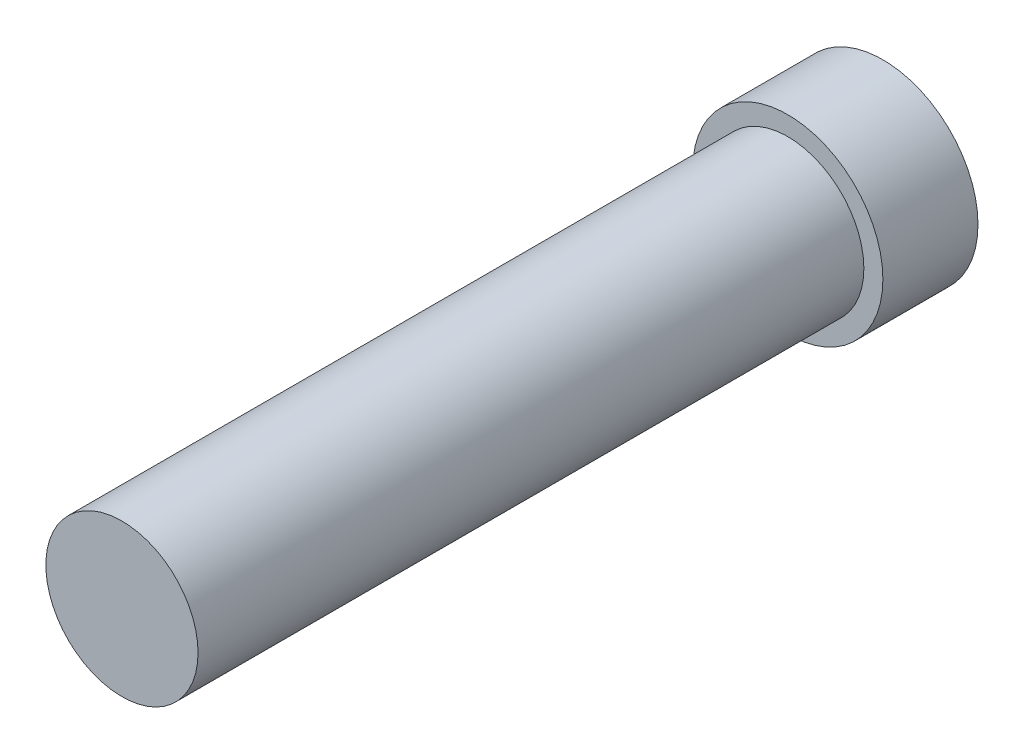
ISO-10303-21;
HEADER;
FILE_DESCRIPTION(('STEP AP214'),'2;1');
FILE_NAME('part.step','',(''),(''),'','','');
FILE_SCHEMA(('AUTOMOTIVE_DESIGN { 1 0 10303 214 1 1 1 1 }'));
ENDSEC;
DATA;
#1=APPLICATION_CONTEXT('core data for automotive mechanical design processes');
#2=APPLICATION_PROTOCOL_DEFINITION('international standard','automotive_design',2000,#1);
#3=PRODUCT_CONTEXT('',#1,'mechanical');
#4=PRODUCT('Part','Part','',(#3));
#5=PRODUCT_RELATED_PRODUCT_CATEGORY('part','',(#4));
#6=PRODUCT_DEFINITION_FORMATION('','',#4);
#7=PRODUCT_DEFINITION_CONTEXT('part definition',#1,'design');
#8=PRODUCT_DEFINITION('design','',#6,#7);
#9=PRODUCT_DEFINITION_SHAPE('','',#8);
#10=(LENGTH_UNIT() NAMED_UNIT(*) SI_UNIT(.MILLI.,.METRE.));
#11=(NAMED_UNIT(*) PLANE_ANGLE_UNIT() SI_UNIT($,.RADIAN.));
#12=(NAMED_UNIT(*) SI_UNIT($,.STERADIAN.) SOLID_ANGLE_UNIT());
#13=UNCERTAINTY_MEASURE_WITH_UNIT(LENGTH_MEASURE(1.E-05),#10,'distance_accuracy_value','');
#14=(GEOMETRIC_REPRESENTATION_CONTEXT(3) GLOBAL_UNCERTAINTY_ASSIGNED_CONTEXT((#13)) GLOBAL_UNIT_ASSIGNED_CONTEXT((#10,
#11,#12)) REPRESENTATION_CONTEXT('',''));
#15=CARTESIAN_POINT('',(0.,0.,0.));
#16=DIRECTION('',(0.,0.,1.));
#17=DIRECTION('',(1.,0.,0.));
#18=AXIS2_PLACEMENT_3D('',#15,#16,#17);
#19=CARTESIAN_POINT('',(0.,0.,40.));
#20=DIRECTION('',(0.,0.,-1.));
#21=DIRECTION('',(-1.,0.,0.));
#22=AXIS2_PLACEMENT_3D('',#19,#20,#21);
#23=CYLINDRICAL_SURFACE('',#22,4.);
#24=CARTESIAN_POINT('',(0.,0.,5.));
#25=DIRECTION('',(0.,0.,1.));
#26=DIRECTION('',(1.,0.,0.));
#27=AXIS2_PLACEMENT_3D('',#24,#25,#26);
#28=CIRCLE('',#27,4.);
#29=CARTESIAN_POINT('',(4.,0.,5.));
#30=VERTEX_POINT('',#29);
#31=EDGE_CURVE('E129',#30,#30,#28,.T.);
#32=ORIENTED_EDGE('',*,*,#31,.T.);
#33=EDGE_LOOP('',(#32));
#34=FACE_BOUND('',#33,.T.);
#35=CARTESIAN_POINT('',(0.,0.,40.));
#36=DIRECTION('',(0.,0.,1.));
#37=DIRECTION('',(1.,0.,0.));
#38=AXIS2_PLACEMENT_3D('',#35,#36,#37);
#39=CIRCLE('',#38,4.);
#40=CARTESIAN_POINT('',(4.,0.,40.));
#41=VERTEX_POINT('',#40);
#42=EDGE_CURVE('E11',#41,#41,#39,.T.);
#43=ORIENTED_EDGE('',*,*,#42,.F.);
#44=EDGE_LOOP('',(#43));
#45=FACE_BOUND('',#44,.T.);
#46=ADVANCED_FACE('F34',(#34,#45),#23,.T.);
#47=CARTESIAN_POINT('',(0.,0.,40.));
#48=DIRECTION('',(0.,0.,1.));
#49=DIRECTION('',(1.,0.,0.));
#50=AXIS2_PLACEMENT_3D('',#47,#48,#49);
#51=PLANE('',#50);
#52=ORIENTED_EDGE('',*,*,#42,.T.);
#53=EDGE_LOOP('',(#52));
#54=FACE_BOUND('',#53,.T.);
#55=ADVANCED_FACE('F160',(#54),#51,.T.);
#56=CARTESIAN_POINT('',(0.,0.,5.));
#57=DIRECTION('',(0.,0.,1.));
#58=DIRECTION('',(1.,0.,0.));
#59=AXIS2_PLACEMENT_3D('',#56,#57,#58);
#60=PLANE('',#59);
#61=CARTESIAN_POINT('',(0.,0.,5.));
#62=DIRECTION('',(0.,0.,1.));
#63=DIRECTION('',(1.,0.,0.));
#64=AXIS2_PLACEMENT_3D('',#61,#62,#63);
#65=CIRCLE('',#64,5.);
#66=CARTESIAN_POINT('',(5.,0.,5.));
#67=VERTEX_POINT('',#66);
#68=EDGE_CURVE('E41',#67,#67,#65,.T.);
#69=ORIENTED_EDGE('',*,*,#68,.T.);
#70=EDGE_LOOP('',(#69));
#71=FACE_BOUND('',#70,.T.);
#72=ORIENTED_EDGE('',*,*,#31,.F.);
#73=EDGE_LOOP('',(#72));
#74=FACE_BOUND('',#73,.T.);
#75=ADVANCED_FACE('F155',(#71,#74),#60,.T.);
#76=CARTESIAN_POINT('',(0.,0.,5.));
#77=DIRECTION('',(0.,0.,-1.));
#78=DIRECTION('',(-1.,0.,0.));
#79=AXIS2_PLACEMENT_3D('',#76,#77,#78);
#80=CYLINDRICAL_SURFACE('',#79,5.);
#81=ORIENTED_EDGE('',*,*,#68,.F.);
#82=EDGE_LOOP('',(#81));
#83=FACE_BOUND('',#82,.T.);
#84=CARTESIAN_POINT('',(0.,0.,0.));
#85=DIRECTION('',(0.,0.,1.));
#86=DIRECTION('',(1.,0.,0.));
#87=AXIS2_PLACEMENT_3D('',#84,#85,#86);
#88=CIRCLE('',#87,5.);
#89=CARTESIAN_POINT('',(5.,0.,0.));
#90=VERTEX_POINT('',#89);
#91=EDGE_CURVE('E139',#90,#90,#88,.T.);
#92=ORIENTED_EDGE('',*,*,#91,.T.);
#93=EDGE_LOOP('',(#92));
#94=FACE_BOUND('',#93,.T.);
#95=ADVANCED_FACE('F144',(#83,#94),#80,.T.);
#96=CARTESIAN_POINT('',(0.,0.,0.));
#97=DIRECTION('',(0.,0.,1.));
#98=DIRECTION('',(1.,0.,0.));
#99=AXIS2_PLACEMENT_3D('',#96,#97,#98);
#100=PLANE('',#99);
#101=DIRECTION('',(0.617569695947535,-0.786516160448893,0.));
#102=VECTOR('',#101,1.);
#103=CARTESIAN_POINT('',(1.60077339692277,3.98986962426751,0.));
#104=LINE('',#103,#102);
#105=CARTESIAN_POINT('',(1.60077339692277,3.98986962426751,0.));
#106=VERTEX_POINT('',#105);
#107=CARTESIAN_POINT('',(4.25571515086492,0.608624384696318,0.));
#108=VERTEX_POINT('',#107);
#109=EDGE_CURVE('E116',#106,#108,#104,.T.);
#110=ORIENTED_EDGE('',*,*,#109,.F.);
#111=DIRECTION('',(0.989927823409507,0.14157296507355,0.));
#112=VECTOR('',#111,1.);
#113=CARTESIAN_POINT('',(-2.65494175394214,3.38124523957119,0.));
#114=LINE('',#113,#112);
#115=CARTESIAN_POINT('',(-2.65494175394214,3.38124523957119,0.));
#116=VERTEX_POINT('',#115);
#117=EDGE_CURVE('E48',#116,#106,#114,.T.);
#118=ORIENTED_EDGE('',*,*,#117,.F.);
#119=DIRECTION('',(0.372358127461972,0.928089125522444,0.));
#120=VECTOR('',#119,1.);
#121=CARTESIAN_POINT('',(-4.25571515086492,-0.608624384696319,0.));
#122=LINE('',#121,#120);
#123=CARTESIAN_POINT('',(-4.25571515086492,-0.608624384696319,0.));
#124=VERTEX_POINT('',#123);
#125=EDGE_CURVE('E92',#124,#116,#122,.T.);
#126=ORIENTED_EDGE('',*,*,#125,.F.);
#127=DIRECTION('',(-0.617569695947535,0.786516160448893,0.));
#128=VECTOR('',#127,1.);
#129=CARTESIAN_POINT('',(-1.60077339692277,-3.98986962426751,0.));
#130=LINE('',#129,#128);
#131=CARTESIAN_POINT('',(-1.60077339692277,-3.98986962426751,0.));
#132=VERTEX_POINT('',#131);
#133=EDGE_CURVE('E124',#132,#124,#130,.T.);
#134=ORIENTED_EDGE('',*,*,#133,.F.);
#135=DIRECTION('',(-0.989927823409506,-0.141572965073551,0.));
#136=VECTOR('',#135,1.);
#137=CARTESIAN_POINT('',(2.65494175394215,-3.38124523957119,0.));
#138=LINE('',#137,#136);
#139=CARTESIAN_POINT('',(2.65494175394215,-3.38124523957119,0.));
#140=VERTEX_POINT('',#139);
#141=EDGE_CURVE('E121',#140,#132,#138,.T.);
#142=ORIENTED_EDGE('',*,*,#141,.F.);
#143=DIRECTION('',(-0.372358127461972,-0.928089125522444,0.));
#144=VECTOR('',#143,1.);
#145=CARTESIAN_POINT('',(4.25571515086492,0.608624384696318,0.));
#146=LINE('',#145,#144);
#147=EDGE_CURVE('E118',#108,#140,#146,.T.);
#148=ORIENTED_EDGE('',*,*,#147,.F.);
#149=EDGE_LOOP('',(#110,#118,#126,#134,#142,#148));
#150=FACE_BOUND('',#149,.T.);
#151=ORIENTED_EDGE('',*,*,#91,.F.);
#152=EDGE_LOOP('',(#151));
#153=FACE_BOUND('',#152,.T.);
#154=ADVANCED_FACE('F146',(#150,#153),#100,.F.);
#155=CARTESIAN_POINT('',(-2.65494175394214,3.38124523957119,1.));
#156=DIRECTION('',(-0.14157296507355,0.989927823409507,0.));
#157=DIRECTION('',(-0.989927823409507,-0.14157296507355,0.));
#158=AXIS2_PLACEMENT_3D('',#155,#156,#157);
#159=PLANE('',#158);
#160=ORIENTED_EDGE('',*,*,#117,.T.);
#161=DIRECTION('',(0.,0.,-1.));
#162=VECTOR('',#161,1.);
#163=CARTESIAN_POINT('',(1.60077339692277,3.98986962426751,1.));
#164=LINE('',#163,#162);
#165=CARTESIAN_POINT('',(1.60077339692277,3.98986962426751,2.));
#166=VERTEX_POINT('',#165);
#167=EDGE_CURVE('E82',#166,#106,#164,.T.);
#168=ORIENTED_EDGE('',*,*,#167,.F.);
#169=DIRECTION('',(0.989927823409507,0.14157296507355,0.));
#170=VECTOR('',#169,1.);
#171=CARTESIAN_POINT('',(-2.65494175394214,3.38124523957119,2.));
#172=LINE('',#171,#170);
#173=CARTESIAN_POINT('',(-2.65494175394214,3.38124523957119,2.));
#174=VERTEX_POINT('',#173);
#175=EDGE_CURVE('E86',#174,#166,#172,.T.);
#176=ORIENTED_EDGE('',*,*,#175,.F.);
#177=DIRECTION('',(0.,0.,-1.));
#178=VECTOR('',#177,1.);
#179=CARTESIAN_POINT('',(-2.65494175394214,3.38124523957119,1.));
#180=LINE('',#179,#178);
#181=EDGE_CURVE('E53',#174,#116,#180,.T.);
#182=ORIENTED_EDGE('',*,*,#181,.T.);
#183=EDGE_LOOP('',(#160,#168,#176,#182));
#184=FACE_BOUND('',#183,.T.);
#185=ADVANCED_FACE('F84',(#184),#159,.F.);
#186=CARTESIAN_POINT('',(-4.25571515086492,-0.608624384696319,1.));
#187=DIRECTION('',(-0.928089125522444,0.372358127461972,0.));
#188=DIRECTION('',(-0.372358127461972,-0.928089125522444,0.));
#189=AXIS2_PLACEMENT_3D('',#186,#187,#188);
#190=PLANE('',#189);
#191=ORIENTED_EDGE('',*,*,#125,.T.);
#192=ORIENTED_EDGE('',*,*,#181,.F.);
#193=DIRECTION('',(0.372358127461972,0.928089125522444,0.));
#194=VECTOR('',#193,1.);
#195=CARTESIAN_POINT('',(-4.25571515086492,-0.608624384696319,2.));
#196=LINE('',#195,#194);
#197=CARTESIAN_POINT('',(-4.25571515086492,-0.608624384696319,2.));
#198=VERTEX_POINT('',#197);
#199=EDGE_CURVE('E105',#198,#174,#196,.T.);
#200=ORIENTED_EDGE('',*,*,#199,.F.);
#201=DIRECTION('',(0.,0.,-1.));
#202=VECTOR('',#201,1.);
#203=CARTESIAN_POINT('',(-4.25571515086492,-0.608624384696319,1.));
#204=LINE('',#203,#202);
#205=EDGE_CURVE('E130',#198,#124,#204,.T.);
#206=ORIENTED_EDGE('',*,*,#205,.T.);
#207=EDGE_LOOP('',(#191,#192,#200,#206));
#208=FACE_BOUND('',#207,.T.);
#209=ADVANCED_FACE('F153',(#208),#190,.F.);
#210=CARTESIAN_POINT('',(-1.60077339692277,-3.98986962426751,1.));
#211=DIRECTION('',(-0.786516160448894,-0.617569695947535,0.));
#212=DIRECTION('',(0.617569695947535,-0.786516160448894,0.));
#213=AXIS2_PLACEMENT_3D('',#210,#211,#212);
#214=PLANE('',#213);
#215=ORIENTED_EDGE('',*,*,#133,.T.);
#216=ORIENTED_EDGE('',*,*,#205,.F.);
#217=DIRECTION('',(-0.617569695947535,0.786516160448893,0.));
#218=VECTOR('',#217,1.);
#219=CARTESIAN_POINT('',(-1.60077339692277,-3.98986962426751,2.));
#220=LINE('',#219,#218);
#221=CARTESIAN_POINT('',(-1.60077339692277,-3.98986962426751,2.));
#222=VERTEX_POINT('',#221);
#223=EDGE_CURVE('E112',#222,#198,#220,.T.);
#224=ORIENTED_EDGE('',*,*,#223,.F.);
#225=DIRECTION('',(0.,0.,-1.));
#226=VECTOR('',#225,1.);
#227=CARTESIAN_POINT('',(-1.60077339692277,-3.98986962426751,1.));
#228=LINE('',#227,#226);
#229=EDGE_CURVE('E132',#222,#132,#228,.T.);
#230=ORIENTED_EDGE('',*,*,#229,.T.);
#231=EDGE_LOOP('',(#215,#216,#224,#230));
#232=FACE_BOUND('',#231,.T.);
#233=ADVANCED_FACE('F185',(#232),#214,.F.);
#234=CARTESIAN_POINT('',(2.65494175394215,-3.38124523957119,1.));
#235=DIRECTION('',(0.141572965073551,-0.989927823409507,0.));
#236=DIRECTION('',(0.989927823409507,0.141572965073551,0.));
#237=AXIS2_PLACEMENT_3D('',#234,#235,#236);
#238=PLANE('',#237);
#239=ORIENTED_EDGE('',*,*,#141,.T.);
#240=ORIENTED_EDGE('',*,*,#229,.F.);
#241=DIRECTION('',(-0.989927823409506,-0.141572965073551,0.));
#242=VECTOR('',#241,1.);
#243=CARTESIAN_POINT('',(2.65494175394215,-3.38124523957119,2.));
#244=LINE('',#243,#242);
#245=CARTESIAN_POINT('',(2.65494175394215,-3.38124523957119,2.));
#246=VERTEX_POINT('',#245);
#247=EDGE_CURVE('E109',#246,#222,#244,.T.);
#248=ORIENTED_EDGE('',*,*,#247,.F.);
#249=DIRECTION('',(0.,0.,-1.));
#250=VECTOR('',#249,1.);
#251=CARTESIAN_POINT('',(2.65494175394215,-3.38124523957119,1.));
#252=LINE('',#251,#250);
#253=EDGE_CURVE('E134',#246,#140,#252,.T.);
#254=ORIENTED_EDGE('',*,*,#253,.T.);
#255=EDGE_LOOP('',(#239,#240,#248,#254));
#256=FACE_BOUND('',#255,.T.);
#257=ADVANCED_FACE('F181',(#256),#238,.F.);
#258=CARTESIAN_POINT('',(4.25571515086492,0.608624384696318,1.));
#259=DIRECTION('',(0.928089125522444,-0.372358127461972,0.));
#260=DIRECTION('',(0.372358127461972,0.928089125522444,0.));
#261=AXIS2_PLACEMENT_3D('',#258,#259,#260);
#262=PLANE('',#261);
#263=ORIENTED_EDGE('',*,*,#147,.T.);
#264=ORIENTED_EDGE('',*,*,#253,.F.);
#265=DIRECTION('',(-0.372358127461972,-0.928089125522444,0.));
#266=VECTOR('',#265,1.);
#267=CARTESIAN_POINT('',(4.25571515086492,0.608624384696318,2.));
#268=LINE('',#267,#266);
#269=CARTESIAN_POINT('',(4.25571515086492,0.608624384696318,2.));
#270=VERTEX_POINT('',#269);
#271=EDGE_CURVE('E100',#270,#246,#268,.T.);
#272=ORIENTED_EDGE('',*,*,#271,.F.);
#273=DIRECTION('',(0.,0.,-1.));
#274=VECTOR('',#273,1.);
#275=CARTESIAN_POINT('',(4.25571515086492,0.608624384696318,1.));
#276=LINE('',#275,#274);
#277=EDGE_CURVE('E91',#270,#108,#276,.T.);
#278=ORIENTED_EDGE('',*,*,#277,.T.);
#279=EDGE_LOOP('',(#263,#264,#272,#278));
#280=FACE_BOUND('',#279,.T.);
#281=ADVANCED_FACE('F178',(#280),#262,.F.);
#282=CARTESIAN_POINT('',(1.60077339692277,3.98986962426751,1.));
#283=DIRECTION('',(0.786516160448893,0.617569695947535,0.));
#284=DIRECTION('',(-0.617569695947535,0.786516160448893,0.));
#285=AXIS2_PLACEMENT_3D('',#282,#283,#284);
#286=PLANE('',#285);
#287=ORIENTED_EDGE('',*,*,#109,.T.);
#288=ORIENTED_EDGE('',*,*,#277,.F.);
#289=DIRECTION('',(0.617569695947535,-0.786516160448893,0.));
#290=VECTOR('',#289,1.);
#291=CARTESIAN_POINT('',(1.60077339692277,3.98986962426751,2.));
#292=LINE('',#291,#290);
#293=EDGE_CURVE('E95',#166,#270,#292,.T.);
#294=ORIENTED_EDGE('',*,*,#293,.F.);
#295=ORIENTED_EDGE('',*,*,#167,.T.);
#296=EDGE_LOOP('',(#287,#288,#294,#295));
#297=FACE_BOUND('',#296,.T.);
#298=ADVANCED_FACE('F96',(#297),#286,.F.);
#299=CARTESIAN_POINT('',(0.,0.,2.));
#300=DIRECTION('',(0.,0.,-1.));
#301=DIRECTION('',(-1.,0.,0.));
#302=AXIS2_PLACEMENT_3D('',#299,#300,#301);
#303=PLANE('',#302);
#304=ORIENTED_EDGE('',*,*,#175,.T.);
#305=ORIENTED_EDGE('',*,*,#293,.T.);
#306=ORIENTED_EDGE('',*,*,#271,.T.);
#307=ORIENTED_EDGE('',*,*,#247,.T.);
#308=ORIENTED_EDGE('',*,*,#223,.T.);
#309=ORIENTED_EDGE('',*,*,#199,.T.);
#310=EDGE_LOOP('',(#304,#305,#306,#307,#308,#309));
#311=FACE_BOUND('',#310,.T.);
#312=ADVANCED_FACE('F102',(#311),#303,.T.);
#313=CLOSED_SHELL('',(#46,#55,#75,#95,#154,#185,#209,#233,#257,#281,#298,#312));
#314=MANIFOLD_SOLID_BREP('B2',#313);
#315=ADVANCED_BREP_SHAPE_REPRESENTATION('',(#18,#314),#14);
#316=SHAPE_DEFINITION_REPRESENTATION(#9,#315);
ENDSEC;
END-ISO-10303-21;
